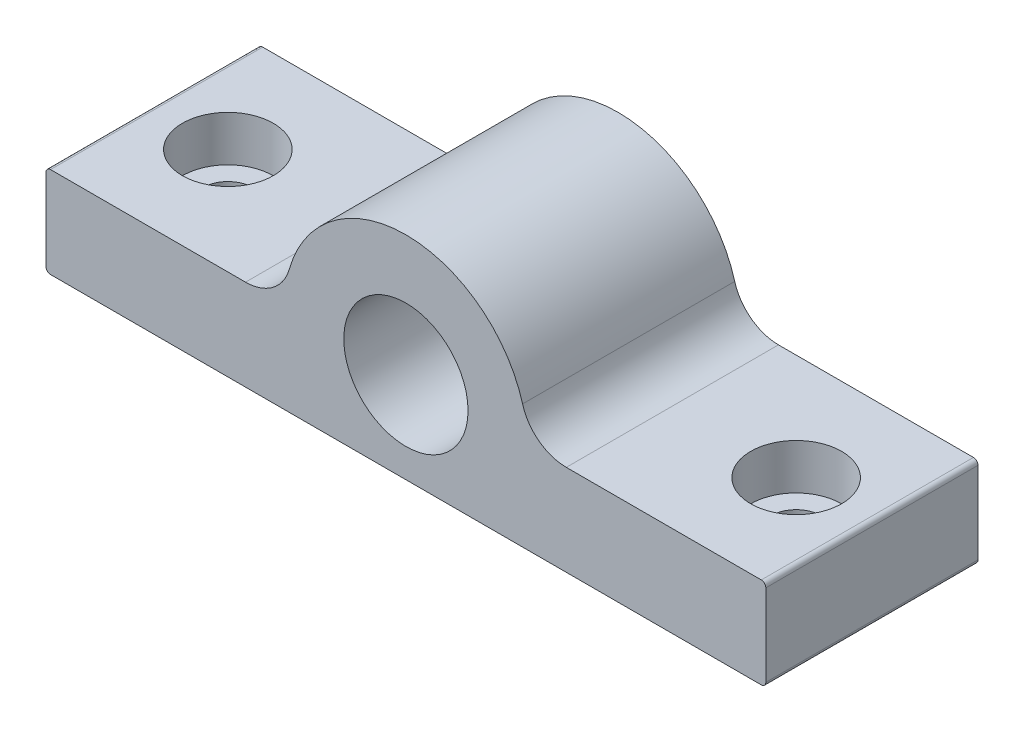
ISO-10303-21;
HEADER;
FILE_DESCRIPTION(('STEP AP214'),'2;1');
FILE_NAME('part.step','',(''),(''),'','','');
FILE_SCHEMA(('AUTOMOTIVE_DESIGN { 1 0 10303 214 1 1 1 1 }'));
ENDSEC;
DATA;
#1=APPLICATION_CONTEXT('core data for automotive mechanical design processes');
#2=APPLICATION_PROTOCOL_DEFINITION('international standard','automotive_design',2000,#1);
#3=PRODUCT_CONTEXT('',#1,'mechanical');
#4=PRODUCT('Part','Part','',(#3));
#5=PRODUCT_RELATED_PRODUCT_CATEGORY('part','',(#4));
#6=PRODUCT_DEFINITION_FORMATION('','',#4);
#7=PRODUCT_DEFINITION_CONTEXT('part definition',#1,'design');
#8=PRODUCT_DEFINITION('design','',#6,#7);
#9=PRODUCT_DEFINITION_SHAPE('','',#8);
#10=(LENGTH_UNIT() NAMED_UNIT(*) SI_UNIT(.MILLI.,.METRE.));
#11=(NAMED_UNIT(*) PLANE_ANGLE_UNIT() SI_UNIT($,.RADIAN.));
#12=(NAMED_UNIT(*) SI_UNIT($,.STERADIAN.) SOLID_ANGLE_UNIT());
#13=UNCERTAINTY_MEASURE_WITH_UNIT(LENGTH_MEASURE(1.E-05),#10,'distance_accuracy_value','');
#14=(GEOMETRIC_REPRESENTATION_CONTEXT(3) GLOBAL_UNCERTAINTY_ASSIGNED_CONTEXT((#13)) GLOBAL_UNIT_ASSIGNED_CONTEXT((#10,
#11,#12)) REPRESENTATION_CONTEXT('',''));
#15=CARTESIAN_POINT('',(0.,0.,0.));
#16=DIRECTION('',(0.,0.,1.));
#17=DIRECTION('',(1.,0.,0.));
#18=AXIS2_PLACEMENT_3D('',#15,#16,#17);
#19=CARTESIAN_POINT('',(5.,0.,-7.));
#20=DIRECTION('',(0.,1.,0.));
#21=DIRECTION('',(0.,0.,1.));
#22=AXIS2_PLACEMENT_3D('',#19,#20,#21);
#23=CYLINDRICAL_SURFACE('',#22,1.65);
#24=CARTESIAN_POINT('',(5.,0.,-7.));
#25=DIRECTION('',(0.,1.,0.));
#26=DIRECTION('',(0.,0.,1.));
#27=AXIS2_PLACEMENT_3D('',#24,#25,#26);
#28=CIRCLE('',#27,1.65);
#29=CARTESIAN_POINT('',(5.,0.,-5.35));
#30=VERTEX_POINT('',#29);
#31=EDGE_CURVE('E283',#30,#30,#28,.T.);
#32=ORIENTED_EDGE('',*,*,#31,.F.);
#33=EDGE_LOOP('',(#32));
#34=FACE_BOUND('',#33,.T.);
#35=CARTESIAN_POINT('',(5.,3.,-7.));
#36=DIRECTION('',(0.,1.,0.));
#37=DIRECTION('',(0.,0.,1.));
#38=AXIS2_PLACEMENT_3D('',#35,#36,#37);
#39=CIRCLE('',#38,1.65);
#40=CARTESIAN_POINT('',(5.,3.,-5.35));
#41=VERTEX_POINT('',#40);
#42=EDGE_CURVE('E194',#41,#41,#39,.F.);
#43=ORIENTED_EDGE('',*,*,#42,.F.);
#44=EDGE_LOOP('',(#43));
#45=FACE_BOUND('',#44,.T.);
#46=ADVANCED_FACE('F52',(#34,#45),#23,.F.);
#47=CARTESIAN_POINT('',(0.,6.,0.));
#48=DIRECTION('',(0.,-1.,0.));
#49=DIRECTION('',(0.,0.,-1.));
#50=AXIS2_PLACEMENT_3D('',#47,#48,#49);
#51=PLANE('',#50);
#52=CARTESIAN_POINT('',(42.5,6.,-7.));
#53=DIRECTION('',(0.,1.,0.));
#54=DIRECTION('',(0.,0.,-1.));
#55=AXIS2_PLACEMENT_3D('',#52,#53,#54);
#56=CIRCLE('',#55,2.99999999999999);
#57=CARTESIAN_POINT('',(42.5,6.,-9.99999999999999));
#58=VERTEX_POINT('',#57);
#59=EDGE_CURVE('E289',#58,#58,#56,.T.);
#60=ORIENTED_EDGE('',*,*,#59,.F.);
#61=EDGE_LOOP('',(#60));
#62=FACE_BOUND('',#61,.T.);
#63=DIRECTION('',(1.,0.,0.));
#64=VECTOR('',#63,1.);
#65=CARTESIAN_POINT('',(0.,6.,0.));
#66=LINE('',#65,#64);
#67=CARTESIAN_POINT('',(34.3330052442584,6.,0.));
#68=VERTEX_POINT('',#67);
#69=CARTESIAN_POINT('',(47.2,6.,0.));
#70=VERTEX_POINT('',#69);
#71=EDGE_CURVE('E159',#68,#70,#66,.T.);
#72=ORIENTED_EDGE('',*,*,#71,.T.);
#73=DIRECTION('',(0.,0.,-1.));
#74=VECTOR('',#73,1.);
#75=CARTESIAN_POINT('',(47.2,6.,0.));
#76=LINE('',#75,#74);
#77=CARTESIAN_POINT('',(47.2,6.,-14.));
#78=VERTEX_POINT('',#77);
#79=EDGE_CURVE('E12',#70,#78,#76,.T.);
#80=ORIENTED_EDGE('',*,*,#79,.T.);
#81=DIRECTION('',(-1.,0.,0.));
#82=VECTOR('',#81,1.);
#83=CARTESIAN_POINT('',(0.,6.,-14.));
#84=LINE('',#83,#82);
#85=CARTESIAN_POINT('',(34.3330052442584,6.,-14.));
#86=VERTEX_POINT('',#85);
#87=EDGE_CURVE('E161',#78,#86,#84,.T.);
#88=ORIENTED_EDGE('',*,*,#87,.T.);
#89=DIRECTION('',(0.,0.,1.));
#90=VECTOR('',#89,1.);
#91=CARTESIAN_POINT('',(34.3330052442584,6.,0.));
#92=LINE('',#91,#90);
#93=EDGE_CURVE('E147',#86,#68,#92,.T.);
#94=ORIENTED_EDGE('',*,*,#93,.T.);
#95=EDGE_LOOP('',(#72,#80,#88,#94));
#96=FACE_BOUND('',#95,.T.);
#97=ADVANCED_FACE('F158',(#62,#96),#51,.F.);
#98=CARTESIAN_POINT('',(0.,6.,0.));
#99=DIRECTION('',(1.,0.,0.));
#100=DIRECTION('',(0.,0.,-1.));
#101=AXIS2_PLACEMENT_3D('',#98,#99,#100);
#102=PLANE('',#101);
#103=DIRECTION('',(0.,-1.,0.));
#104=VECTOR('',#103,1.);
#105=CARTESIAN_POINT('',(0.,6.,-14.));
#106=LINE('',#105,#104);
#107=CARTESIAN_POINT('',(0.,5.7,-14.));
#108=VERTEX_POINT('',#107);
#109=CARTESIAN_POINT('',(0.,0.3,-14.));
#110=VERTEX_POINT('',#109);
#111=EDGE_CURVE('E183',#108,#110,#106,.T.);
#112=ORIENTED_EDGE('',*,*,#111,.T.);
#113=DIRECTION('',(0.,0.,1.));
#114=VECTOR('',#113,1.);
#115=CARTESIAN_POINT('',(0.,0.3,0.));
#116=LINE('',#115,#114);
#117=CARTESIAN_POINT('',(0.,0.3,0.));
#118=VERTEX_POINT('',#117);
#119=EDGE_CURVE('E214',#110,#118,#116,.T.);
#120=ORIENTED_EDGE('',*,*,#119,.T.);
#121=DIRECTION('',(0.,-1.,0.));
#122=VECTOR('',#121,1.);
#123=CARTESIAN_POINT('',(0.,6.,0.));
#124=LINE('',#123,#122);
#125=CARTESIAN_POINT('',(0.,5.7,0.));
#126=VERTEX_POINT('',#125);
#127=EDGE_CURVE('E164',#126,#118,#124,.T.);
#128=ORIENTED_EDGE('',*,*,#127,.F.);
#129=DIRECTION('',(0.,0.,1.));
#130=VECTOR('',#129,1.);
#131=CARTESIAN_POINT('',(0.,5.7,0.));
#132=LINE('',#131,#130);
#133=EDGE_CURVE('E212',#126,#108,#132,.F.);
#134=ORIENTED_EDGE('',*,*,#133,.T.);
#135=EDGE_LOOP('',(#112,#120,#128,#134));
#136=FACE_BOUND('',#135,.T.);
#137=ADVANCED_FACE('F256',(#136),#102,.F.);
#138=CARTESIAN_POINT('',(0.,6.,0.));
#139=DIRECTION('',(0.,0.,-1.));
#140=DIRECTION('',(-1.,0.,0.));
#141=AXIS2_PLACEMENT_3D('',#138,#139,#140);
#142=PLANE('',#141);
#143=CARTESIAN_POINT('',(23.75,5.99999999999999,0.));
#144=DIRECTION('',(0.,0.,1.));
#145=DIRECTION('',(1.,0.,0.));
#146=AXIS2_PLACEMENT_3D('',#143,#144,#145);
#147=CIRCLE('',#146,4.1);
#148=CARTESIAN_POINT('',(27.85,5.99999999999999,0.));
#149=VERTEX_POINT('',#148);
#150=EDGE_CURVE('E279',#149,#149,#147,.T.);
#151=ORIENTED_EDGE('',*,*,#150,.F.);
#152=EDGE_LOOP('',(#151));
#153=FACE_BOUND('',#152,.T.);
#154=ORIENTED_EDGE('',*,*,#127,.T.);
#155=CARTESIAN_POINT('',(0.3,0.3,0.));
#156=DIRECTION('',(0.,0.,-1.));
#157=DIRECTION('',(-1.,0.,0.));
#158=AXIS2_PLACEMENT_3D('',#155,#156,#157);
#159=CIRCLE('',#158,0.3);
#160=CARTESIAN_POINT('',(0.3,0.,0.));
#161=VERTEX_POINT('',#160);
#162=EDGE_CURVE('E222',#118,#161,#159,.F.);
#163=ORIENTED_EDGE('',*,*,#162,.T.);
#164=DIRECTION('',(1.,0.,0.));
#165=VECTOR('',#164,1.);
#166=CARTESIAN_POINT('',(0.,0.,0.));
#167=LINE('',#166,#165);
#168=CARTESIAN_POINT('',(47.2,0.,0.));
#169=VERTEX_POINT('',#168);
#170=EDGE_CURVE('E176',#161,#169,#167,.T.);
#171=ORIENTED_EDGE('',*,*,#170,.T.);
#172=CARTESIAN_POINT('',(47.2,0.3,0.));
#173=DIRECTION('',(0.,0.,-1.));
#174=DIRECTION('',(-1.,0.,0.));
#175=AXIS2_PLACEMENT_3D('',#172,#173,#174);
#176=CIRCLE('',#175,0.3);
#177=CARTESIAN_POINT('',(47.5,0.3,0.));
#178=VERTEX_POINT('',#177);
#179=EDGE_CURVE('E218',#169,#178,#176,.F.);
#180=ORIENTED_EDGE('',*,*,#179,.T.);
#181=DIRECTION('',(0.,-1.,0.));
#182=VECTOR('',#181,1.);
#183=CARTESIAN_POINT('',(47.5,6.,0.));
#184=LINE('',#183,#182);
#185=CARTESIAN_POINT('',(47.5,5.7,0.));
#186=VERTEX_POINT('',#185);
#187=EDGE_CURVE('E190',#186,#178,#184,.T.);
#188=ORIENTED_EDGE('',*,*,#187,.F.);
#189=CARTESIAN_POINT('',(47.2,5.7,0.));
#190=DIRECTION('',(0.,0.,-1.));
#191=DIRECTION('',(-1.,0.,0.));
#192=AXIS2_PLACEMENT_3D('',#189,#190,#191);
#193=CIRCLE('',#192,0.3);
#194=EDGE_CURVE('E170',#186,#70,#193,.F.);
#195=ORIENTED_EDGE('',*,*,#194,.T.);
#196=ORIENTED_EDGE('',*,*,#71,.F.);
#197=CARTESIAN_POINT('',(34.3330052442584,9.,0.));
#198=DIRECTION('',(0.,0.,-1.));
#199=DIRECTION('',(-1.,0.,0.));
#200=AXIS2_PLACEMENT_3D('',#197,#198,#199);
#201=CIRCLE('',#200,3.);
#202=CARTESIAN_POINT('',(31.4467310867334,8.18181818181818,0.));
#203=VERTEX_POINT('',#202);
#204=EDGE_CURVE('E143',#68,#203,#201,.T.);
#205=ORIENTED_EDGE('',*,*,#204,.T.);
#206=CARTESIAN_POINT('',(23.75,6.,0.));
#207=DIRECTION('',(0.,0.,1.));
#208=DIRECTION('',(1.,0.,0.));
#209=AXIS2_PLACEMENT_3D('',#206,#207,#208);
#210=CIRCLE('',#209,8.);
#211=CARTESIAN_POINT('',(16.0532689132666,8.18181818181818,0.));
#212=VERTEX_POINT('',#211);
#213=EDGE_CURVE('E276',#203,#212,#210,.T.);
#214=ORIENTED_EDGE('',*,*,#213,.T.);
#215=CARTESIAN_POINT('',(13.1669947557416,9.,0.));
#216=DIRECTION('',(0.,0.,-1.));
#217=DIRECTION('',(-1.,0.,0.));
#218=AXIS2_PLACEMENT_3D('',#215,#216,#217);
#219=CIRCLE('',#218,3.);
#220=CARTESIAN_POINT('',(13.1669947557416,6.,0.));
#221=VERTEX_POINT('',#220);
#222=EDGE_CURVE('E207',#212,#221,#219,.T.);
#223=ORIENTED_EDGE('',*,*,#222,.T.);
#224=CARTESIAN_POINT('',(0.3,6.,0.));
#225=VERTEX_POINT('',#224);
#226=EDGE_CURVE('E171',#225,#221,#66,.T.);
#227=ORIENTED_EDGE('',*,*,#226,.F.);
#228=CARTESIAN_POINT('',(0.3,5.7,0.));
#229=DIRECTION('',(0.,0.,-1.));
#230=DIRECTION('',(-1.,0.,0.));
#231=AXIS2_PLACEMENT_3D('',#228,#229,#230);
#232=CIRCLE('',#231,0.3);
#233=EDGE_CURVE('E220',#225,#126,#232,.F.);
#234=ORIENTED_EDGE('',*,*,#233,.T.);
#235=EDGE_LOOP('',(#154,#163,#171,#180,#188,#195,#196,#205,#214,#223,#227,#234));
#236=FACE_BOUND('',#235,.T.);
#237=ADVANCED_FACE('F167',(#153,#236),#142,.F.);
#238=CARTESIAN_POINT('',(47.5,6.,0.));
#239=DIRECTION('',(-1.,0.,0.));
#240=DIRECTION('',(0.,0.,1.));
#241=AXIS2_PLACEMENT_3D('',#238,#239,#240);
#242=PLANE('',#241);
#243=ORIENTED_EDGE('',*,*,#187,.T.);
#244=DIRECTION('',(0.,0.,-1.));
#245=VECTOR('',#244,1.);
#246=CARTESIAN_POINT('',(47.5,0.3,-14.));
#247=LINE('',#246,#245);
#248=CARTESIAN_POINT('',(47.5,0.3,-14.));
#249=VERTEX_POINT('',#248);
#250=EDGE_CURVE('E60',#178,#249,#247,.T.);
#251=ORIENTED_EDGE('',*,*,#250,.T.);
#252=DIRECTION('',(0.,-1.,0.));
#253=VECTOR('',#252,1.);
#254=CARTESIAN_POINT('',(47.5,6.,-14.));
#255=LINE('',#254,#253);
#256=CARTESIAN_POINT('',(47.5,5.7,-14.));
#257=VERTEX_POINT('',#256);
#258=EDGE_CURVE('E188',#257,#249,#255,.T.);
#259=ORIENTED_EDGE('',*,*,#258,.F.);
#260=DIRECTION('',(0.,0.,-1.));
#261=VECTOR('',#260,1.);
#262=CARTESIAN_POINT('',(47.5,5.7,0.));
#263=LINE('',#262,#261);
#264=EDGE_CURVE('E237',#257,#186,#263,.F.);
#265=ORIENTED_EDGE('',*,*,#264,.T.);
#266=EDGE_LOOP('',(#243,#251,#259,#265));
#267=FACE_BOUND('',#266,.T.);
#268=ADVANCED_FACE('F239',(#267),#242,.F.);
#269=CARTESIAN_POINT('',(0.,6.,-14.));
#270=DIRECTION('',(0.,0.,1.));
#271=DIRECTION('',(1.,0.,0.));
#272=AXIS2_PLACEMENT_3D('',#269,#270,#271);
#273=PLANE('',#272);
#274=CARTESIAN_POINT('',(23.75,5.99999999999999,-14.));
#275=DIRECTION('',(0.,0.,1.));
#276=DIRECTION('',(1.,0.,0.));
#277=AXIS2_PLACEMENT_3D('',#274,#275,#276);
#278=CIRCLE('',#277,4.1);
#279=CARTESIAN_POINT('',(27.85,5.99999999999999,-14.));
#280=VERTEX_POINT('',#279);
#281=EDGE_CURVE('E277',#280,#280,#278,.T.);
#282=ORIENTED_EDGE('',*,*,#281,.T.);
#283=EDGE_LOOP('',(#282));
#284=FACE_BOUND('',#283,.T.);
#285=DIRECTION('',(-1.,0.,0.));
#286=VECTOR('',#285,1.);
#287=CARTESIAN_POINT('',(0.,0.,-14.));
#288=LINE('',#287,#286);
#289=CARTESIAN_POINT('',(47.2,0.,-14.));
#290=VERTEX_POINT('',#289);
#291=CARTESIAN_POINT('',(0.3,0.,-14.));
#292=VERTEX_POINT('',#291);
#293=EDGE_CURVE('E172',#290,#292,#288,.T.);
#294=ORIENTED_EDGE('',*,*,#293,.T.);
#295=CARTESIAN_POINT('',(0.3,0.3,-14.));
#296=DIRECTION('',(0.,0.,1.));
#297=DIRECTION('',(1.,0.,0.));
#298=AXIS2_PLACEMENT_3D('',#295,#296,#297);
#299=CIRCLE('',#298,0.3);
#300=EDGE_CURVE('E232',#292,#110,#299,.F.);
#301=ORIENTED_EDGE('',*,*,#300,.T.);
#302=ORIENTED_EDGE('',*,*,#111,.F.);
#303=CARTESIAN_POINT('',(0.3,5.7,-14.));
#304=DIRECTION('',(0.,0.,1.));
#305=DIRECTION('',(1.,0.,0.));
#306=AXIS2_PLACEMENT_3D('',#303,#304,#305);
#307=CIRCLE('',#306,0.3);
#308=CARTESIAN_POINT('',(0.3,6.,-14.));
#309=VERTEX_POINT('',#308);
#310=EDGE_CURVE('E230',#108,#309,#307,.F.);
#311=ORIENTED_EDGE('',*,*,#310,.T.);
#312=CARTESIAN_POINT('',(13.1669947557416,6.,-14.));
#313=VERTEX_POINT('',#312);
#314=EDGE_CURVE('E174',#313,#309,#84,.T.);
#315=ORIENTED_EDGE('',*,*,#314,.F.);
#316=CARTESIAN_POINT('',(13.1669947557416,9.,-14.));
#317=DIRECTION('',(0.,0.,1.));
#318=DIRECTION('',(1.,0.,0.));
#319=AXIS2_PLACEMENT_3D('',#316,#317,#318);
#320=CIRCLE('',#319,3.);
#321=CARTESIAN_POINT('',(16.0532689132666,8.18181818181818,-14.));
#322=VERTEX_POINT('',#321);
#323=EDGE_CURVE('E210',#313,#322,#320,.T.);
#324=ORIENTED_EDGE('',*,*,#323,.T.);
#325=CARTESIAN_POINT('',(23.75,6.,-14.));
#326=DIRECTION('',(0.,0.,1.));
#327=DIRECTION('',(1.,0.,0.));
#328=AXIS2_PLACEMENT_3D('',#325,#326,#327);
#329=CIRCLE('',#328,8.);
#330=CARTESIAN_POINT('',(31.4467310867334,8.18181818181818,-14.));
#331=VERTEX_POINT('',#330);
#332=EDGE_CURVE('E180',#322,#331,#329,.F.);
#333=ORIENTED_EDGE('',*,*,#332,.T.);
#334=CARTESIAN_POINT('',(34.3330052442584,9.,-14.));
#335=DIRECTION('',(0.,0.,1.));
#336=DIRECTION('',(1.,0.,0.));
#337=AXIS2_PLACEMENT_3D('',#334,#335,#336);
#338=CIRCLE('',#337,3.);
#339=EDGE_CURVE('E153',#331,#86,#338,.T.);
#340=ORIENTED_EDGE('',*,*,#339,.T.);
#341=ORIENTED_EDGE('',*,*,#87,.F.);
#342=CARTESIAN_POINT('',(47.2,5.7,-14.));
#343=DIRECTION('',(0.,0.,1.));
#344=DIRECTION('',(1.,0.,0.));
#345=AXIS2_PLACEMENT_3D('',#342,#343,#344);
#346=CIRCLE('',#345,0.3);
#347=EDGE_CURVE('E75',#78,#257,#346,.F.);
#348=ORIENTED_EDGE('',*,*,#347,.T.);
#349=ORIENTED_EDGE('',*,*,#258,.T.);
#350=CARTESIAN_POINT('',(47.2,0.3,-14.));
#351=DIRECTION('',(0.,0.,1.));
#352=DIRECTION('',(1.,0.,0.));
#353=AXIS2_PLACEMENT_3D('',#350,#351,#352);
#354=CIRCLE('',#353,0.3);
#355=EDGE_CURVE('E67',#249,#290,#354,.F.);
#356=ORIENTED_EDGE('',*,*,#355,.T.);
#357=EDGE_LOOP('',(#294,#301,#302,#311,#315,#324,#333,#340,#341,#348,#349,#356));
#358=FACE_BOUND('',#357,.T.);
#359=ADVANCED_FACE('F242',(#284,#358),#273,.F.);
#360=CARTESIAN_POINT('',(5.,6.,-7.));
#361=DIRECTION('',(0.,1.,0.));
#362=DIRECTION('',(0.,0.,1.));
#363=AXIS2_PLACEMENT_3D('',#360,#361,#362);
#364=CIRCLE('',#363,3.);
#365=CARTESIAN_POINT('',(5.,6.,-4.));
#366=VERTEX_POINT('',#365);
#367=EDGE_CURVE('E295',#366,#366,#364,.T.);
#368=ORIENTED_EDGE('',*,*,#367,.F.);
#369=EDGE_LOOP('',(#368));
#370=FACE_BOUND('',#369,.T.);
#371=ORIENTED_EDGE('',*,*,#314,.T.);
#372=DIRECTION('',(0.,0.,1.));
#373=VECTOR('',#372,1.);
#374=CARTESIAN_POINT('',(0.3,6.,0.));
#375=LINE('',#374,#373);
#376=EDGE_CURVE('E234',#309,#225,#375,.T.);
#377=ORIENTED_EDGE('',*,*,#376,.T.);
#378=ORIENTED_EDGE('',*,*,#226,.T.);
#379=DIRECTION('',(0.,0.,1.));
#380=VECTOR('',#379,1.);
#381=CARTESIAN_POINT('',(13.1669947557416,6.,0.));
#382=LINE('',#381,#380);
#383=EDGE_CURVE('E154',#221,#313,#382,.F.);
#384=ORIENTED_EDGE('',*,*,#383,.T.);
#385=EDGE_LOOP('',(#371,#377,#378,#384));
#386=FACE_BOUND('',#385,.T.);
#387=ADVANCED_FACE('F266',(#370,#386),#51,.F.);
#388=CARTESIAN_POINT('',(0.,0.,0.));
#389=DIRECTION('',(0.,-1.,0.));
#390=DIRECTION('',(0.,0.,-1.));
#391=AXIS2_PLACEMENT_3D('',#388,#389,#390);
#392=PLANE('',#391);
#393=ORIENTED_EDGE('',*,*,#31,.T.);
#394=EDGE_LOOP('',(#393));
#395=FACE_BOUND('',#394,.T.);
#396=CARTESIAN_POINT('',(42.5,0.,-7.));
#397=DIRECTION('',(0.,1.,0.));
#398=DIRECTION('',(0.,0.,-1.));
#399=AXIS2_PLACEMENT_3D('',#396,#397,#398);
#400=CIRCLE('',#399,1.65);
#401=CARTESIAN_POINT('',(42.5,0.,-8.65));
#402=VERTEX_POINT('',#401);
#403=EDGE_CURVE('E200',#402,#402,#400,.T.);
#404=ORIENTED_EDGE('',*,*,#403,.T.);
#405=EDGE_LOOP('',(#404));
#406=FACE_BOUND('',#405,.T.);
#407=ORIENTED_EDGE('',*,*,#170,.F.);
#408=DIRECTION('',(0.,0.,1.));
#409=VECTOR('',#408,1.);
#410=CARTESIAN_POINT('',(0.3,0.,-14.));
#411=LINE('',#410,#409);
#412=EDGE_CURVE('E226',#161,#292,#411,.F.);
#413=ORIENTED_EDGE('',*,*,#412,.T.);
#414=ORIENTED_EDGE('',*,*,#293,.F.);
#415=DIRECTION('',(0.,0.,-1.));
#416=VECTOR('',#415,1.);
#417=CARTESIAN_POINT('',(47.2,0.,0.));
#418=LINE('',#417,#416);
#419=EDGE_CURVE('E224',#290,#169,#418,.F.);
#420=ORIENTED_EDGE('',*,*,#419,.T.);
#421=EDGE_LOOP('',(#407,#413,#414,#420));
#422=FACE_BOUND('',#421,.T.);
#423=ADVANCED_FACE('F247',(#395,#406,#422),#392,.T.);
#424=CARTESIAN_POINT('',(23.75,6.,-33.8900916138902));
#425=DIRECTION('',(0.,0.,1.));
#426=DIRECTION('',(1.,0.,0.));
#427=AXIS2_PLACEMENT_3D('',#424,#425,#426);
#428=CYLINDRICAL_SURFACE('',#427,8.);
#429=ORIENTED_EDGE('',*,*,#213,.F.);
#430=DIRECTION('',(0.,0.,1.));
#431=VECTOR('',#430,1.);
#432=CARTESIAN_POINT('',(31.4467310867334,8.18181818181818,-33.8900916138902));
#433=LINE('',#432,#431);
#434=EDGE_CURVE('E148',#203,#331,#433,.F.);
#435=ORIENTED_EDGE('',*,*,#434,.T.);
#436=ORIENTED_EDGE('',*,*,#332,.F.);
#437=DIRECTION('',(0.,0.,1.));
#438=VECTOR('',#437,1.);
#439=CARTESIAN_POINT('',(16.0532689132666,8.18181818181818,-33.8900916138902));
#440=LINE('',#439,#438);
#441=EDGE_CURVE('E163',#322,#212,#440,.T.);
#442=ORIENTED_EDGE('',*,*,#441,.T.);
#443=EDGE_LOOP('',(#429,#435,#436,#442));
#444=FACE_BOUND('',#443,.T.);
#445=ADVANCED_FACE('F275',(#444),#428,.T.);
#446=CARTESIAN_POINT('',(23.75,5.99999999999999,-14.));
#447=DIRECTION('',(0.,0.,1.));
#448=DIRECTION('',(1.,0.,0.));
#449=AXIS2_PLACEMENT_3D('',#446,#447,#448);
#450=CYLINDRICAL_SURFACE('',#449,4.1);
#451=ORIENTED_EDGE('',*,*,#281,.F.);
#452=EDGE_LOOP('',(#451));
#453=FACE_BOUND('',#452,.T.);
#454=ORIENTED_EDGE('',*,*,#150,.T.);
#455=EDGE_LOOP('',(#454));
#456=FACE_BOUND('',#455,.T.);
#457=ADVANCED_FACE('F338',(#453,#456),#450,.F.);
#458=CARTESIAN_POINT('',(42.5,0.,-7.));
#459=DIRECTION('',(0.,1.,0.));
#460=DIRECTION('',(0.,0.,1.));
#461=AXIS2_PLACEMENT_3D('',#458,#459,#460);
#462=CYLINDRICAL_SURFACE('',#461,1.65);
#463=CARTESIAN_POINT('',(42.5,3.,-7.));
#464=DIRECTION('',(0.,-1.,0.));
#465=DIRECTION('',(0.,0.,-1.));
#466=AXIS2_PLACEMENT_3D('',#463,#464,#465);
#467=CIRCLE('',#466,1.65);
#468=CARTESIAN_POINT('',(42.5,3.,-8.65));
#469=VERTEX_POINT('',#468);
#470=EDGE_CURVE('E197',#469,#469,#467,.F.);
#471=ORIENTED_EDGE('',*,*,#470,.T.);
#472=EDGE_LOOP('',(#471));
#473=FACE_BOUND('',#472,.T.);
#474=ORIENTED_EDGE('',*,*,#403,.F.);
#475=EDGE_LOOP('',(#474));
#476=FACE_BOUND('',#475,.T.);
#477=ADVANCED_FACE('F335',(#473,#476),#462,.F.);
#478=CARTESIAN_POINT('',(5.,3.,-7.));
#479=DIRECTION('',(0.,1.,0.));
#480=DIRECTION('',(0.,0.,1.));
#481=AXIS2_PLACEMENT_3D('',#478,#479,#480);
#482=PLANE('',#481);
#483=CARTESIAN_POINT('',(5.,3.,-7.));
#484=DIRECTION('',(0.,1.,0.));
#485=DIRECTION('',(0.,0.,1.));
#486=AXIS2_PLACEMENT_3D('',#483,#484,#485);
#487=CIRCLE('',#486,3.);
#488=CARTESIAN_POINT('',(5.,3.,-4.));
#489=VERTEX_POINT('',#488);
#490=EDGE_CURVE('E198',#489,#489,#487,.T.);
#491=ORIENTED_EDGE('',*,*,#490,.T.);
#492=EDGE_LOOP('',(#491));
#493=FACE_BOUND('',#492,.T.);
#494=ORIENTED_EDGE('',*,*,#42,.T.);
#495=EDGE_LOOP('',(#494));
#496=FACE_BOUND('',#495,.T.);
#497=ADVANCED_FACE('F301',(#493,#496),#482,.T.);
#498=CARTESIAN_POINT('',(5.,3.,-7.));
#499=DIRECTION('',(0.,1.,0.));
#500=DIRECTION('',(0.,0.,1.));
#501=AXIS2_PLACEMENT_3D('',#498,#499,#500);
#502=CYLINDRICAL_SURFACE('',#501,3.);
#503=ORIENTED_EDGE('',*,*,#490,.F.);
#504=EDGE_LOOP('',(#503));
#505=FACE_BOUND('',#504,.T.);
#506=ORIENTED_EDGE('',*,*,#367,.T.);
#507=EDGE_LOOP('',(#506));
#508=FACE_BOUND('',#507,.T.);
#509=ADVANCED_FACE('F304',(#505,#508),#502,.F.);
#510=CARTESIAN_POINT('',(42.5,3.,-7.));
#511=DIRECTION('',(0.,-1.,0.));
#512=DIRECTION('',(0.,0.,-1.));
#513=AXIS2_PLACEMENT_3D('',#510,#511,#512);
#514=PLANE('',#513);
#515=CARTESIAN_POINT('',(42.5,3.,-7.));
#516=DIRECTION('',(0.,1.,0.));
#517=DIRECTION('',(0.,0.,-1.));
#518=AXIS2_PLACEMENT_3D('',#515,#516,#517);
#519=CIRCLE('',#518,2.99999999999999);
#520=CARTESIAN_POINT('',(42.5,3.,-9.99999999999999));
#521=VERTEX_POINT('',#520);
#522=EDGE_CURVE('E292',#521,#521,#519,.T.);
#523=ORIENTED_EDGE('',*,*,#522,.T.);
#524=EDGE_LOOP('',(#523));
#525=FACE_BOUND('',#524,.T.);
#526=ORIENTED_EDGE('',*,*,#470,.F.);
#527=EDGE_LOOP('',(#526));
#528=FACE_BOUND('',#527,.T.);
#529=ADVANCED_FACE('F307',(#525,#528),#514,.F.);
#530=CARTESIAN_POINT('',(42.5,3.,-7.));
#531=DIRECTION('',(0.,1.,0.));
#532=DIRECTION('',(0.,0.,1.));
#533=AXIS2_PLACEMENT_3D('',#530,#531,#532);
#534=CYLINDRICAL_SURFACE('',#533,2.99999999999999);
#535=ORIENTED_EDGE('',*,*,#522,.F.);
#536=EDGE_LOOP('',(#535));
#537=FACE_BOUND('',#536,.T.);
#538=ORIENTED_EDGE('',*,*,#59,.T.);
#539=EDGE_LOOP('',(#538));
#540=FACE_BOUND('',#539,.T.);
#541=ADVANCED_FACE('F333',(#537,#540),#534,.F.);
#542=CARTESIAN_POINT('',(34.3330052442584,9.,-33.8900916138902));
#543=DIRECTION('',(0.,0.,1.));
#544=DIRECTION('',(1.,0.,0.));
#545=AXIS2_PLACEMENT_3D('',#542,#543,#544);
#546=CYLINDRICAL_SURFACE('',#545,3.);
#547=ORIENTED_EDGE('',*,*,#339,.F.);
#548=ORIENTED_EDGE('',*,*,#434,.F.);
#549=ORIENTED_EDGE('',*,*,#204,.F.);
#550=ORIENTED_EDGE('',*,*,#93,.F.);
#551=EDGE_LOOP('',(#547,#548,#549,#550));
#552=FACE_BOUND('',#551,.T.);
#553=ADVANCED_FACE('F146',(#552),#546,.F.);
#554=CARTESIAN_POINT('',(13.1669947557416,9.,-33.8900916138902));
#555=DIRECTION('',(0.,0.,1.));
#556=DIRECTION('',(1.,0.,0.));
#557=AXIS2_PLACEMENT_3D('',#554,#555,#556);
#558=CYLINDRICAL_SURFACE('',#557,3.);
#559=ORIENTED_EDGE('',*,*,#323,.F.);
#560=ORIENTED_EDGE('',*,*,#383,.F.);
#561=ORIENTED_EDGE('',*,*,#222,.F.);
#562=ORIENTED_EDGE('',*,*,#441,.F.);
#563=EDGE_LOOP('',(#559,#560,#561,#562));
#564=FACE_BOUND('',#563,.T.);
#565=ADVANCED_FACE('F270',(#564),#558,.F.);
#566=CARTESIAN_POINT('',(0.3,0.3,0.));
#567=DIRECTION('',(0.,0.,-1.));
#568=DIRECTION('',(-1.,0.,0.));
#569=AXIS2_PLACEMENT_3D('',#566,#567,#568);
#570=CYLINDRICAL_SURFACE('',#569,0.3);
#571=ORIENTED_EDGE('',*,*,#300,.F.);
#572=ORIENTED_EDGE('',*,*,#412,.F.);
#573=ORIENTED_EDGE('',*,*,#162,.F.);
#574=ORIENTED_EDGE('',*,*,#119,.F.);
#575=EDGE_LOOP('',(#571,#572,#573,#574));
#576=FACE_BOUND('',#575,.T.);
#577=ADVANCED_FACE('F251',(#576),#570,.T.);
#578=CARTESIAN_POINT('',(0.3,5.7,0.));
#579=DIRECTION('',(0.,0.,1.));
#580=DIRECTION('',(1.,0.,0.));
#581=AXIS2_PLACEMENT_3D('',#578,#579,#580);
#582=CYLINDRICAL_SURFACE('',#581,0.3);
#583=ORIENTED_EDGE('',*,*,#310,.F.);
#584=ORIENTED_EDGE('',*,*,#133,.F.);
#585=ORIENTED_EDGE('',*,*,#233,.F.);
#586=ORIENTED_EDGE('',*,*,#376,.F.);
#587=EDGE_LOOP('',(#583,#584,#585,#586));
#588=FACE_BOUND('',#587,.T.);
#589=ADVANCED_FACE('F260',(#588),#582,.T.);
#590=CARTESIAN_POINT('',(47.2,0.3,0.));
#591=DIRECTION('',(0.,0.,1.));
#592=DIRECTION('',(1.,0.,0.));
#593=AXIS2_PLACEMENT_3D('',#590,#591,#592);
#594=CYLINDRICAL_SURFACE('',#593,0.3);
#595=ORIENTED_EDGE('',*,*,#179,.F.);
#596=ORIENTED_EDGE('',*,*,#419,.F.);
#597=ORIENTED_EDGE('',*,*,#355,.F.);
#598=ORIENTED_EDGE('',*,*,#250,.F.);
#599=EDGE_LOOP('',(#595,#596,#597,#598));
#600=FACE_BOUND('',#599,.T.);
#601=ADVANCED_FACE('F249',(#600),#594,.T.);
#602=CARTESIAN_POINT('',(47.2,5.7,0.));
#603=DIRECTION('',(0.,0.,-1.));
#604=DIRECTION('',(-1.,0.,0.));
#605=AXIS2_PLACEMENT_3D('',#602,#603,#604);
#606=CYLINDRICAL_SURFACE('',#605,0.3);
#607=ORIENTED_EDGE('',*,*,#194,.F.);
#608=ORIENTED_EDGE('',*,*,#264,.F.);
#609=ORIENTED_EDGE('',*,*,#347,.F.);
#610=ORIENTED_EDGE('',*,*,#79,.F.);
#611=EDGE_LOOP('',(#607,#608,#609,#610));
#612=FACE_BOUND('',#611,.T.);
#613=ADVANCED_FACE('F54',(#612),#606,.T.);
#614=CLOSED_SHELL('',(#46,#97,#137,#237,#268,#359,#387,#423,#445,#457,#477,#497,#509,#529,#541,
#553,#565,#577,#589,#601,#613));
#615=MANIFOLD_SOLID_BREP('B2',#614);
#616=ADVANCED_BREP_SHAPE_REPRESENTATION('',(#18,#615),#14);
#617=SHAPE_DEFINITION_REPRESENTATION(#9,#616);
ENDSEC;
END-ISO-10303-21;
